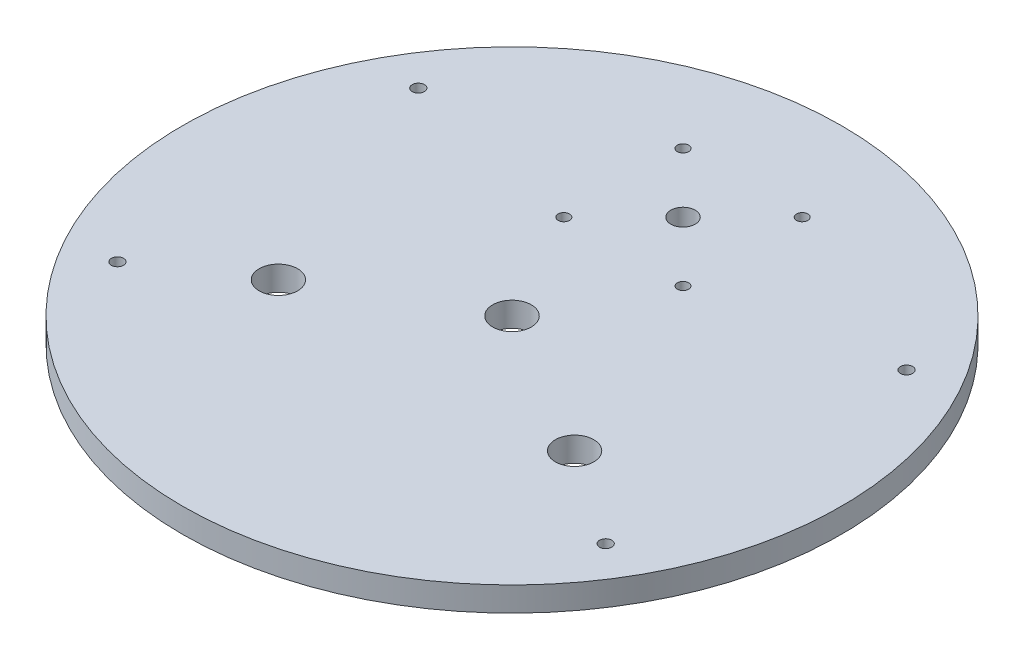
ISO-10303-21;
HEADER;
FILE_DESCRIPTION(('STEP AP214'),'2;1');
FILE_NAME('part.step','',(''),(''),'','','');
FILE_SCHEMA(('AUTOMOTIVE_DESIGN { 1 0 10303 214 1 1 1 1 }'));
ENDSEC;
DATA;
#1=APPLICATION_CONTEXT('core data for automotive mechanical design processes');
#2=APPLICATION_PROTOCOL_DEFINITION('international standard','automotive_design',2000,#1);
#3=PRODUCT_CONTEXT('',#1,'mechanical');
#4=PRODUCT('Part','Part','',(#3));
#5=PRODUCT_RELATED_PRODUCT_CATEGORY('part','',(#4));
#6=PRODUCT_DEFINITION_FORMATION('','',#4);
#7=PRODUCT_DEFINITION_CONTEXT('part definition',#1,'design');
#8=PRODUCT_DEFINITION('design','',#6,#7);
#9=PRODUCT_DEFINITION_SHAPE('','',#8);
#10=(LENGTH_UNIT() NAMED_UNIT(*) SI_UNIT(.MILLI.,.METRE.));
#11=(NAMED_UNIT(*) PLANE_ANGLE_UNIT() SI_UNIT($,.RADIAN.));
#12=(NAMED_UNIT(*) SI_UNIT($,.STERADIAN.) SOLID_ANGLE_UNIT());
#13=UNCERTAINTY_MEASURE_WITH_UNIT(LENGTH_MEASURE(1.E-05),#10,'distance_accuracy_value','');
#14=(GEOMETRIC_REPRESENTATION_CONTEXT(3) GLOBAL_UNCERTAINTY_ASSIGNED_CONTEXT((#13)) GLOBAL_UNIT_ASSIGNED_CONTEXT((#10,
#11,#12)) REPRESENTATION_CONTEXT('',''));
#15=CARTESIAN_POINT('',(0.,0.,0.));
#16=DIRECTION('',(0.,0.,1.));
#17=DIRECTION('',(1.,0.,0.));
#18=AXIS2_PLACEMENT_3D('',#15,#16,#17);
#19=CARTESIAN_POINT('',(0.,6.35,0.));
#20=DIRECTION('',(0.,-1.,0.));
#21=DIRECTION('',(0.,0.,-1.));
#22=AXIS2_PLACEMENT_3D('',#19,#20,#21);
#23=CYLINDRICAL_SURFACE('',#22,85.725);
#24=CARTESIAN_POINT('',(0.,6.35,0.));
#25=DIRECTION('',(0.,1.,0.));
#26=DIRECTION('',(0.,0.,1.));
#27=AXIS2_PLACEMENT_3D('',#24,#25,#26);
#28=CIRCLE('',#27,85.725);
#29=CARTESIAN_POINT('',(0.,6.35,85.725));
#30=VERTEX_POINT('',#29);
#31=EDGE_CURVE('E10',#30,#30,#28,.T.);
#32=ORIENTED_EDGE('',*,*,#31,.F.);
#33=EDGE_LOOP('',(#32));
#34=FACE_BOUND('',#33,.T.);
#35=CARTESIAN_POINT('',(0.,0.,0.));
#36=DIRECTION('',(0.,1.,0.));
#37=DIRECTION('',(0.,0.,1.));
#38=AXIS2_PLACEMENT_3D('',#35,#36,#37);
#39=CIRCLE('',#38,85.725);
#40=CARTESIAN_POINT('',(0.,0.,85.725));
#41=VERTEX_POINT('',#40);
#42=EDGE_CURVE('E35',#41,#41,#39,.T.);
#43=ORIENTED_EDGE('',*,*,#42,.T.);
#44=EDGE_LOOP('',(#43));
#45=FACE_BOUND('',#44,.T.);
#46=ADVANCED_FACE('F32',(#34,#45),#23,.T.);
#47=CARTESIAN_POINT('',(0.,6.35,0.));
#48=DIRECTION('',(0.,1.,0.));
#49=DIRECTION('',(0.,0.,1.));
#50=AXIS2_PLACEMENT_3D('',#47,#48,#49);
#51=PLANE('',#50);
#52=CARTESIAN_POINT('',(0.,6.35,0.));
#53=DIRECTION('',(0.,1.,0.));
#54=DIRECTION('',(0.,0.,1.));
#55=AXIS2_PLACEMENT_3D('',#52,#53,#54);
#56=CIRCLE('',#55,5.0165);
#57=CARTESIAN_POINT('',(0.,6.35,5.0165));
#58=VERTEX_POINT('',#57);
#59=EDGE_CURVE('E112',#58,#58,#56,.T.);
#60=ORIENTED_EDGE('',*,*,#59,.F.);
#61=EDGE_LOOP('',(#60));
#62=FACE_BOUND('',#61,.T.);
#63=CARTESIAN_POINT('',(15.50035,6.35,-59.982608));
#64=DIRECTION('',(0.,1.,0.));
#65=DIRECTION('',(0.,0.,1.));
#66=AXIS2_PLACEMENT_3D('',#63,#64,#65);
#67=CIRCLE('',#66,1.4732);
#68=CARTESIAN_POINT('',(15.50035,6.35,-58.509408));
#69=VERTEX_POINT('',#68);
#70=EDGE_CURVE('E95',#69,#69,#67,.T.);
#71=ORIENTED_EDGE('',*,*,#70,.F.);
#72=EDGE_LOOP('',(#71));
#73=FACE_BOUND('',#72,.T.);
#74=CARTESIAN_POINT('',(-15.50035,6.35,-28.981908));
#75=DIRECTION('',(0.,1.,0.));
#76=DIRECTION('',(0.,0.,1.));
#77=AXIS2_PLACEMENT_3D('',#74,#75,#76);
#78=CIRCLE('',#77,1.4732);
#79=CARTESIAN_POINT('',(-15.50035,6.35,-27.508708));
#80=VERTEX_POINT('',#79);
#81=EDGE_CURVE('E96',#80,#80,#78,.T.);
#82=ORIENTED_EDGE('',*,*,#81,.F.);
#83=EDGE_LOOP('',(#82));
#84=FACE_BOUND('',#83,.T.);
#85=CARTESIAN_POINT('',(15.50035,6.35,-28.981908));
#86=DIRECTION('',(0.,1.,0.));
#87=DIRECTION('',(0.,0.,1.));
#88=AXIS2_PLACEMENT_3D('',#85,#86,#87);
#89=CIRCLE('',#88,1.4732);
#90=CARTESIAN_POINT('',(15.50035,6.35,-27.508708));
#91=VERTEX_POINT('',#90);
#92=EDGE_CURVE('E106',#91,#91,#89,.T.);
#93=ORIENTED_EDGE('',*,*,#92,.F.);
#94=EDGE_LOOP('',(#93));
#95=FACE_BOUND('',#94,.T.);
#96=CARTESIAN_POINT('',(-15.50035,6.35,-59.982608));
#97=DIRECTION('',(0.,1.,0.));
#98=DIRECTION('',(0.,0.,1.));
#99=AXIS2_PLACEMENT_3D('',#96,#97,#98);
#100=CIRCLE('',#99,1.4732);
#101=CARTESIAN_POINT('',(-15.50035,6.35,-58.509408));
#102=VERTEX_POINT('',#101);
#103=EDGE_CURVE('E88',#102,#102,#100,.T.);
#104=ORIENTED_EDGE('',*,*,#103,.F.);
#105=EDGE_LOOP('',(#104));
#106=FACE_BOUND('',#105,.T.);
#107=CARTESIAN_POINT('',(38.5227654456936,6.35,22.2411289999999));
#108=DIRECTION('',(0.,1.,0.));
#109=DIRECTION('',(0.,0.,1.));
#110=AXIS2_PLACEMENT_3D('',#107,#108,#109);
#111=CIRCLE('',#110,5.);
#112=CARTESIAN_POINT('',(38.5227654456936,6.35,27.2411289999999));
#113=VERTEX_POINT('',#112);
#114=EDGE_CURVE('E79',#113,#113,#111,.T.);
#115=ORIENTED_EDGE('',*,*,#114,.F.);
#116=EDGE_LOOP('',(#115));
#117=FACE_BOUND('',#116,.T.);
#118=CARTESIAN_POINT('',(0.,6.35,-44.482258));
#119=DIRECTION('',(0.,1.,0.));
#120=DIRECTION('',(0.,0.,1.));
#121=AXIS2_PLACEMENT_3D('',#118,#119,#120);
#122=CIRCLE('',#121,3.17499999999999);
#123=CARTESIAN_POINT('',(0.,6.35,-41.307258));
#124=VERTEX_POINT('',#123);
#125=EDGE_CURVE('E76',#124,#124,#122,.T.);
#126=ORIENTED_EDGE('',*,*,#125,.F.);
#127=EDGE_LOOP('',(#126));
#128=FACE_BOUND('',#127,.T.);
#129=CARTESIAN_POINT('',(-38.5227654456936,6.35,22.2411289999999));
#130=DIRECTION('',(0.,1.,0.));
#131=DIRECTION('',(0.,0.,1.));
#132=AXIS2_PLACEMENT_3D('',#129,#130,#131);
#133=CIRCLE('',#132,5.);
#134=CARTESIAN_POINT('',(-38.5227654456936,6.35,27.2411289999999));
#135=VERTEX_POINT('',#134);
#136=EDGE_CURVE('E68',#135,#135,#133,.T.);
#137=ORIENTED_EDGE('',*,*,#136,.F.);
#138=EDGE_LOOP('',(#137));
#139=FACE_BOUND('',#138,.T.);
#140=CARTESIAN_POINT('',(63.5,6.35,-39.13251));
#141=DIRECTION('',(0.,1.,0.));
#142=DIRECTION('',(0.,0.,1.));
#143=AXIS2_PLACEMENT_3D('',#140,#141,#142);
#144=CIRCLE('',#143,1.5875);
#145=CARTESIAN_POINT('',(63.5,6.35,-37.54501));
#146=VERTEX_POINT('',#145);
#147=EDGE_CURVE('E53',#146,#146,#144,.T.);
#148=ORIENTED_EDGE('',*,*,#147,.F.);
#149=EDGE_LOOP('',(#148));
#150=FACE_BOUND('',#149,.T.);
#151=CARTESIAN_POINT('',(-63.5,6.35,39.13251));
#152=DIRECTION('',(0.,1.,0.));
#153=DIRECTION('',(0.,0.,1.));
#154=AXIS2_PLACEMENT_3D('',#151,#152,#153);
#155=CIRCLE('',#154,1.58749999999998);
#156=CARTESIAN_POINT('',(-63.5,6.35,40.72001));
#157=VERTEX_POINT('',#156);
#158=EDGE_CURVE('E54',#157,#157,#155,.T.);
#159=ORIENTED_EDGE('',*,*,#158,.F.);
#160=EDGE_LOOP('',(#159));
#161=FACE_BOUND('',#160,.T.);
#162=CARTESIAN_POINT('',(63.5,6.35,39.13251));
#163=DIRECTION('',(0.,1.,0.));
#164=DIRECTION('',(0.,0.,1.));
#165=AXIS2_PLACEMENT_3D('',#162,#163,#164);
#166=CIRCLE('',#165,1.5875);
#167=CARTESIAN_POINT('',(63.5,6.35,40.72001));
#168=VERTEX_POINT('',#167);
#169=EDGE_CURVE('E64',#168,#168,#166,.T.);
#170=ORIENTED_EDGE('',*,*,#169,.F.);
#171=EDGE_LOOP('',(#170));
#172=FACE_BOUND('',#171,.T.);
#173=CARTESIAN_POINT('',(-63.5,6.35,-39.13251));
#174=DIRECTION('',(0.,1.,0.));
#175=DIRECTION('',(0.,0.,1.));
#176=AXIS2_PLACEMENT_3D('',#173,#174,#175);
#177=CIRCLE('',#176,1.58749999999996);
#178=CARTESIAN_POINT('',(-63.5,6.35,-37.54501));
#179=VERTEX_POINT('',#178);
#180=EDGE_CURVE('E46',#179,#179,#177,.T.);
#181=ORIENTED_EDGE('',*,*,#180,.F.);
#182=EDGE_LOOP('',(#181));
#183=FACE_BOUND('',#182,.T.);
#184=ORIENTED_EDGE('',*,*,#31,.T.);
#185=EDGE_LOOP('',(#184));
#186=FACE_BOUND('',#185,.T.);
#187=ADVANCED_FACE('F119',(#62,#73,#84,#95,#106,#117,#128,#139,#150,#161,#172,#183,#186),#51,.T.);
#188=CARTESIAN_POINT('',(0.,0.,0.));
#189=DIRECTION('',(0.,1.,0.));
#190=DIRECTION('',(0.,0.,1.));
#191=AXIS2_PLACEMENT_3D('',#188,#189,#190);
#192=PLANE('',#191);
#193=CARTESIAN_POINT('',(0.,0.,0.));
#194=DIRECTION('',(0.,1.,0.));
#195=DIRECTION('',(0.,0.,1.));
#196=AXIS2_PLACEMENT_3D('',#193,#194,#195);
#197=CIRCLE('',#196,5.0165);
#198=CARTESIAN_POINT('',(0.,0.,5.0165));
#199=VERTEX_POINT('',#198);
#200=EDGE_CURVE('E109',#199,#199,#197,.F.);
#201=ORIENTED_EDGE('',*,*,#200,.F.);
#202=EDGE_LOOP('',(#201));
#203=FACE_BOUND('',#202,.T.);
#204=CARTESIAN_POINT('',(15.50035,0.,-59.982608));
#205=DIRECTION('',(0.,1.,0.));
#206=DIRECTION('',(0.,0.,1.));
#207=AXIS2_PLACEMENT_3D('',#204,#205,#206);
#208=CIRCLE('',#207,1.4732);
#209=CARTESIAN_POINT('',(15.50035,0.,-58.509408));
#210=VERTEX_POINT('',#209);
#211=EDGE_CURVE('E91',#210,#210,#208,.F.);
#212=ORIENTED_EDGE('',*,*,#211,.F.);
#213=EDGE_LOOP('',(#212));
#214=FACE_BOUND('',#213,.T.);
#215=CARTESIAN_POINT('',(-15.50035,0.,-28.981908));
#216=DIRECTION('',(0.,1.,0.));
#217=DIRECTION('',(0.,0.,1.));
#218=AXIS2_PLACEMENT_3D('',#215,#216,#217);
#219=CIRCLE('',#218,1.4732);
#220=CARTESIAN_POINT('',(-15.50035,0.,-27.508708));
#221=VERTEX_POINT('',#220);
#222=EDGE_CURVE('E92',#221,#221,#219,.F.);
#223=ORIENTED_EDGE('',*,*,#222,.F.);
#224=EDGE_LOOP('',(#223));
#225=FACE_BOUND('',#224,.T.);
#226=CARTESIAN_POINT('',(15.50035,0.,-28.981908));
#227=DIRECTION('',(0.,1.,0.));
#228=DIRECTION('',(0.,0.,1.));
#229=AXIS2_PLACEMENT_3D('',#226,#227,#228);
#230=CIRCLE('',#229,1.4732);
#231=CARTESIAN_POINT('',(15.50035,0.,-27.508708));
#232=VERTEX_POINT('',#231);
#233=EDGE_CURVE('E99',#232,#232,#230,.F.);
#234=ORIENTED_EDGE('',*,*,#233,.F.);
#235=EDGE_LOOP('',(#234));
#236=FACE_BOUND('',#235,.T.);
#237=CARTESIAN_POINT('',(-15.50035,0.,-59.982608));
#238=DIRECTION('',(0.,1.,0.));
#239=DIRECTION('',(0.,0.,1.));
#240=AXIS2_PLACEMENT_3D('',#237,#238,#239);
#241=CIRCLE('',#240,1.4732);
#242=CARTESIAN_POINT('',(-15.50035,0.,-58.509408));
#243=VERTEX_POINT('',#242);
#244=EDGE_CURVE('E75',#243,#243,#241,.F.);
#245=ORIENTED_EDGE('',*,*,#244,.F.);
#246=EDGE_LOOP('',(#245));
#247=FACE_BOUND('',#246,.T.);
#248=CARTESIAN_POINT('',(38.5227654456936,0.,22.2411289999999));
#249=DIRECTION('',(0.,1.,0.));
#250=DIRECTION('',(0.,0.,1.));
#251=AXIS2_PLACEMENT_3D('',#248,#249,#250);
#252=CIRCLE('',#251,5.);
#253=CARTESIAN_POINT('',(38.5227654456936,0.,27.2411289999999));
#254=VERTEX_POINT('',#253);
#255=EDGE_CURVE('E67',#254,#254,#252,.F.);
#256=ORIENTED_EDGE('',*,*,#255,.F.);
#257=EDGE_LOOP('',(#256));
#258=FACE_BOUND('',#257,.T.);
#259=CARTESIAN_POINT('',(0.,0.,-44.482258));
#260=DIRECTION('',(0.,1.,0.));
#261=DIRECTION('',(0.,0.,1.));
#262=AXIS2_PLACEMENT_3D('',#259,#260,#261);
#263=CIRCLE('',#262,3.17499999999999);
#264=CARTESIAN_POINT('',(0.,0.,-41.307258));
#265=VERTEX_POINT('',#264);
#266=EDGE_CURVE('E71',#265,#265,#263,.F.);
#267=ORIENTED_EDGE('',*,*,#266,.F.);
#268=EDGE_LOOP('',(#267));
#269=FACE_BOUND('',#268,.T.);
#270=CARTESIAN_POINT('',(-38.5227654456936,0.,22.2411289999999));
#271=DIRECTION('',(0.,1.,0.));
#272=DIRECTION('',(0.,0.,1.));
#273=AXIS2_PLACEMENT_3D('',#270,#271,#272);
#274=CIRCLE('',#273,5.);
#275=CARTESIAN_POINT('',(-38.5227654456936,0.,27.2411289999999));
#276=VERTEX_POINT('',#275);
#277=EDGE_CURVE('E72',#276,#276,#274,.F.);
#278=ORIENTED_EDGE('',*,*,#277,.F.);
#279=EDGE_LOOP('',(#278));
#280=FACE_BOUND('',#279,.T.);
#281=CARTESIAN_POINT('',(63.5,0.,-39.13251));
#282=DIRECTION('',(0.,1.,0.));
#283=DIRECTION('',(0.,0.,1.));
#284=AXIS2_PLACEMENT_3D('',#281,#282,#283);
#285=CIRCLE('',#284,1.5875);
#286=CARTESIAN_POINT('',(63.5,0.,-37.54501));
#287=VERTEX_POINT('',#286);
#288=EDGE_CURVE('E49',#287,#287,#285,.F.);
#289=ORIENTED_EDGE('',*,*,#288,.F.);
#290=EDGE_LOOP('',(#289));
#291=FACE_BOUND('',#290,.T.);
#292=CARTESIAN_POINT('',(-63.5,0.,39.13251));
#293=DIRECTION('',(0.,1.,0.));
#294=DIRECTION('',(0.,0.,1.));
#295=AXIS2_PLACEMENT_3D('',#292,#293,#294);
#296=CIRCLE('',#295,1.58749999999998);
#297=CARTESIAN_POINT('',(-63.5,0.,40.72001));
#298=VERTEX_POINT('',#297);
#299=EDGE_CURVE('E50',#298,#298,#296,.F.);
#300=ORIENTED_EDGE('',*,*,#299,.F.);
#301=EDGE_LOOP('',(#300));
#302=FACE_BOUND('',#301,.T.);
#303=CARTESIAN_POINT('',(63.5,0.,39.13251));
#304=DIRECTION('',(0.,1.,0.));
#305=DIRECTION('',(0.,0.,1.));
#306=AXIS2_PLACEMENT_3D('',#303,#304,#305);
#307=CIRCLE('',#306,1.5875);
#308=CARTESIAN_POINT('',(63.5,0.,40.72001));
#309=VERTEX_POINT('',#308);
#310=EDGE_CURVE('E57',#309,#309,#307,.F.);
#311=ORIENTED_EDGE('',*,*,#310,.F.);
#312=EDGE_LOOP('',(#311));
#313=FACE_BOUND('',#312,.T.);
#314=CARTESIAN_POINT('',(-63.5,0.,-39.13251));
#315=DIRECTION('',(0.,1.,0.));
#316=DIRECTION('',(0.,0.,1.));
#317=AXIS2_PLACEMENT_3D('',#314,#315,#316);
#318=CIRCLE('',#317,1.58749999999996);
#319=CARTESIAN_POINT('',(-63.5,0.,-37.54501));
#320=VERTEX_POINT('',#319);
#321=EDGE_CURVE('E42',#320,#320,#318,.F.);
#322=ORIENTED_EDGE('',*,*,#321,.F.);
#323=EDGE_LOOP('',(#322));
#324=FACE_BOUND('',#323,.T.);
#325=ORIENTED_EDGE('',*,*,#42,.F.);
#326=EDGE_LOOP('',(#325));
#327=FACE_BOUND('',#326,.T.);
#328=ADVANCED_FACE('F122',(#203,#214,#225,#236,#247,#258,#269,#280,#291,#302,#313,#324,#327),
#192,.F.);
#329=CARTESIAN_POINT('',(-63.5,-0.00100000000000013,-39.13251));
#330=DIRECTION('',(0.,1.,0.));
#331=DIRECTION('',(0.,0.,1.));
#332=AXIS2_PLACEMENT_3D('',#329,#330,#331);
#333=CYLINDRICAL_SURFACE('',#332,1.58749999999996);
#334=ORIENTED_EDGE('',*,*,#180,.T.);
#335=EDGE_LOOP('',(#334));
#336=FACE_BOUND('',#335,.T.);
#337=ORIENTED_EDGE('',*,*,#321,.T.);
#338=EDGE_LOOP('',(#337));
#339=FACE_BOUND('',#338,.T.);
#340=ADVANCED_FACE('F146',(#336,#339),#333,.F.);
#341=CARTESIAN_POINT('',(63.5,-0.00100000000000013,39.13251));
#342=DIRECTION('',(0.,1.,0.));
#343=DIRECTION('',(0.,0.,1.));
#344=AXIS2_PLACEMENT_3D('',#341,#342,#343);
#345=CYLINDRICAL_SURFACE('',#344,1.5875);
#346=ORIENTED_EDGE('',*,*,#169,.T.);
#347=EDGE_LOOP('',(#346));
#348=FACE_BOUND('',#347,.T.);
#349=ORIENTED_EDGE('',*,*,#310,.T.);
#350=EDGE_LOOP('',(#349));
#351=FACE_BOUND('',#350,.T.);
#352=ADVANCED_FACE('F149',(#348,#351),#345,.F.);
#353=CARTESIAN_POINT('',(-63.5,-0.00100000000000013,39.13251));
#354=DIRECTION('',(0.,1.,0.));
#355=DIRECTION('',(0.,0.,1.));
#356=AXIS2_PLACEMENT_3D('',#353,#354,#355);
#357=CYLINDRICAL_SURFACE('',#356,1.58749999999998);
#358=ORIENTED_EDGE('',*,*,#158,.T.);
#359=EDGE_LOOP('',(#358));
#360=FACE_BOUND('',#359,.T.);
#361=ORIENTED_EDGE('',*,*,#299,.T.);
#362=EDGE_LOOP('',(#361));
#363=FACE_BOUND('',#362,.T.);
#364=ADVANCED_FACE('F182',(#360,#363),#357,.F.);
#365=CARTESIAN_POINT('',(63.5,-0.00100000000000013,-39.13251));
#366=DIRECTION('',(0.,1.,0.));
#367=DIRECTION('',(0.,0.,1.));
#368=AXIS2_PLACEMENT_3D('',#365,#366,#367);
#369=CYLINDRICAL_SURFACE('',#368,1.5875);
#370=ORIENTED_EDGE('',*,*,#147,.T.);
#371=EDGE_LOOP('',(#370));
#372=FACE_BOUND('',#371,.T.);
#373=ORIENTED_EDGE('',*,*,#288,.T.);
#374=EDGE_LOOP('',(#373));
#375=FACE_BOUND('',#374,.T.);
#376=ADVANCED_FACE('F190',(#372,#375),#369,.F.);
#377=CARTESIAN_POINT('',(-38.5227654456936,-0.00100000000000013,22.2411289999999));
#378=DIRECTION('',(0.,1.,0.));
#379=DIRECTION('',(0.,0.,1.));
#380=AXIS2_PLACEMENT_3D('',#377,#378,#379);
#381=CYLINDRICAL_SURFACE('',#380,5.);
#382=ORIENTED_EDGE('',*,*,#136,.T.);
#383=EDGE_LOOP('',(#382));
#384=FACE_BOUND('',#383,.T.);
#385=ORIENTED_EDGE('',*,*,#277,.T.);
#386=EDGE_LOOP('',(#385));
#387=FACE_BOUND('',#386,.T.);
#388=ADVANCED_FACE('F198',(#384,#387),#381,.F.);
#389=CARTESIAN_POINT('',(0.,-0.00100000000000013,-44.482258));
#390=DIRECTION('',(0.,1.,0.));
#391=DIRECTION('',(0.,0.,1.));
#392=AXIS2_PLACEMENT_3D('',#389,#390,#391);
#393=CYLINDRICAL_SURFACE('',#392,3.17499999999999);
#394=ORIENTED_EDGE('',*,*,#125,.T.);
#395=EDGE_LOOP('',(#394));
#396=FACE_BOUND('',#395,.T.);
#397=ORIENTED_EDGE('',*,*,#266,.T.);
#398=EDGE_LOOP('',(#397));
#399=FACE_BOUND('',#398,.T.);
#400=ADVANCED_FACE('F206',(#396,#399),#393,.F.);
#401=CARTESIAN_POINT('',(38.5227654456936,-0.00100000000000013,22.2411289999999));
#402=DIRECTION('',(0.,1.,0.));
#403=DIRECTION('',(0.,0.,1.));
#404=AXIS2_PLACEMENT_3D('',#401,#402,#403);
#405=CYLINDRICAL_SURFACE('',#404,5.);
#406=ORIENTED_EDGE('',*,*,#114,.T.);
#407=EDGE_LOOP('',(#406));
#408=FACE_BOUND('',#407,.T.);
#409=ORIENTED_EDGE('',*,*,#255,.T.);
#410=EDGE_LOOP('',(#409));
#411=FACE_BOUND('',#410,.T.);
#412=ADVANCED_FACE('F214',(#408,#411),#405,.F.);
#413=CARTESIAN_POINT('',(-15.50035,-0.00100000000000013,-59.982608));
#414=DIRECTION('',(0.,1.,0.));
#415=DIRECTION('',(0.,0.,1.));
#416=AXIS2_PLACEMENT_3D('',#413,#414,#415);
#417=CYLINDRICAL_SURFACE('',#416,1.4732);
#418=ORIENTED_EDGE('',*,*,#103,.T.);
#419=EDGE_LOOP('',(#418));
#420=FACE_BOUND('',#419,.T.);
#421=ORIENTED_EDGE('',*,*,#244,.T.);
#422=EDGE_LOOP('',(#421));
#423=FACE_BOUND('',#422,.T.);
#424=ADVANCED_FACE('F222',(#420,#423),#417,.F.);
#425=CARTESIAN_POINT('',(15.50035,-0.00100000000000013,-28.981908));
#426=DIRECTION('',(0.,1.,0.));
#427=DIRECTION('',(0.,0.,1.));
#428=AXIS2_PLACEMENT_3D('',#425,#426,#427);
#429=CYLINDRICAL_SURFACE('',#428,1.4732);
#430=ORIENTED_EDGE('',*,*,#92,.T.);
#431=EDGE_LOOP('',(#430));
#432=FACE_BOUND('',#431,.T.);
#433=ORIENTED_EDGE('',*,*,#233,.T.);
#434=EDGE_LOOP('',(#433));
#435=FACE_BOUND('',#434,.T.);
#436=ADVANCED_FACE('F230',(#432,#435),#429,.F.);
#437=CARTESIAN_POINT('',(-15.50035,-0.00100000000000013,-28.981908));
#438=DIRECTION('',(0.,1.,0.));
#439=DIRECTION('',(0.,0.,1.));
#440=AXIS2_PLACEMENT_3D('',#437,#438,#439);
#441=CYLINDRICAL_SURFACE('',#440,1.4732);
#442=ORIENTED_EDGE('',*,*,#81,.T.);
#443=EDGE_LOOP('',(#442));
#444=FACE_BOUND('',#443,.T.);
#445=ORIENTED_EDGE('',*,*,#222,.T.);
#446=EDGE_LOOP('',(#445));
#447=FACE_BOUND('',#446,.T.);
#448=ADVANCED_FACE('F238',(#444,#447),#441,.F.);
#449=CARTESIAN_POINT('',(15.50035,-0.00100000000000013,-59.982608));
#450=DIRECTION('',(0.,1.,0.));
#451=DIRECTION('',(0.,0.,1.));
#452=AXIS2_PLACEMENT_3D('',#449,#450,#451);
#453=CYLINDRICAL_SURFACE('',#452,1.4732);
#454=ORIENTED_EDGE('',*,*,#70,.T.);
#455=EDGE_LOOP('',(#454));
#456=FACE_BOUND('',#455,.T.);
#457=ORIENTED_EDGE('',*,*,#211,.T.);
#458=EDGE_LOOP('',(#457));
#459=FACE_BOUND('',#458,.T.);
#460=ADVANCED_FACE('F246',(#456,#459),#453,.F.);
#461=CARTESIAN_POINT('',(0.,-0.00100000000000013,0.));
#462=DIRECTION('',(0.,1.,0.));
#463=DIRECTION('',(0.,0.,1.));
#464=AXIS2_PLACEMENT_3D('',#461,#462,#463);
#465=CYLINDRICAL_SURFACE('',#464,5.0165);
#466=ORIENTED_EDGE('',*,*,#59,.T.);
#467=EDGE_LOOP('',(#466));
#468=FACE_BOUND('',#467,.T.);
#469=ORIENTED_EDGE('',*,*,#200,.T.);
#470=EDGE_LOOP('',(#469));
#471=FACE_BOUND('',#470,.T.);
#472=ADVANCED_FACE('F116',(#468,#471),#465,.F.);
#473=CLOSED_SHELL('',(#46,#187,#328,#340,#352,#364,#376,#388,#400,#412,#424,#436,#448,#460,#472));
#474=MANIFOLD_SOLID_BREP('B2',#473);
#475=ADVANCED_BREP_SHAPE_REPRESENTATION('',(#18,#474),#14);
#476=SHAPE_DEFINITION_REPRESENTATION(#9,#475);
ENDSEC;
END-ISO-10303-21;
